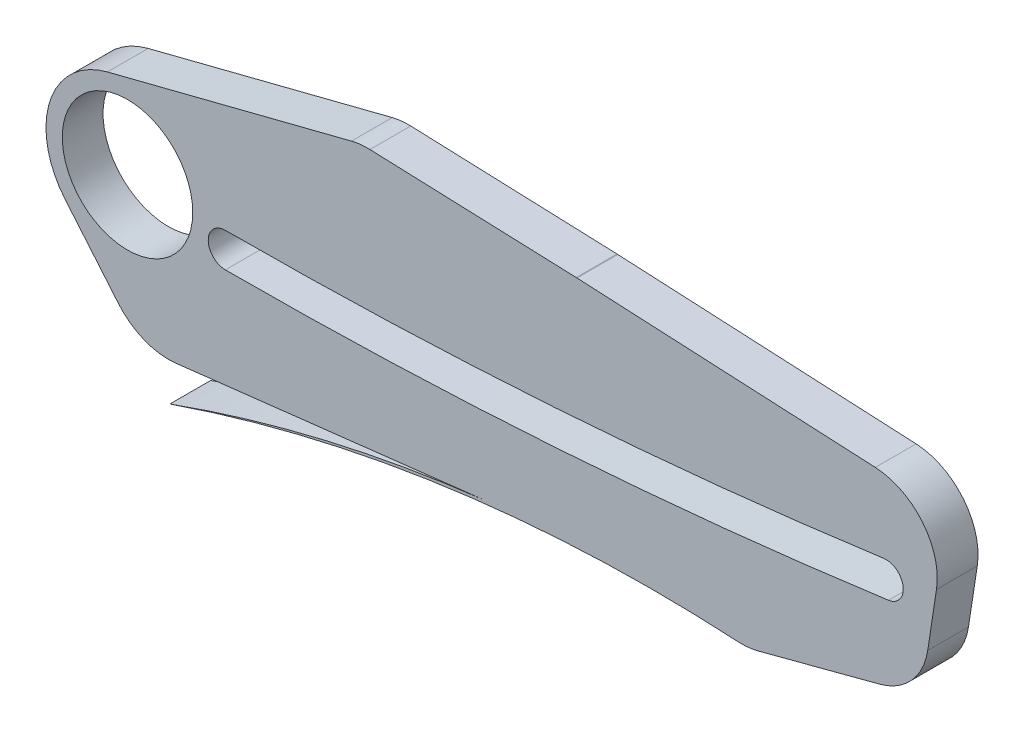
ISO-10303-21;
HEADER;
FILE_DESCRIPTION(('STEP AP214'),'2;1');
FILE_NAME('part.step','',(''),(''),'','','');
FILE_SCHEMA(('AUTOMOTIVE_DESIGN { 1 0 10303 214 1 1 1 1 }'));
ENDSEC;
DATA;
#1=APPLICATION_CONTEXT('core data for automotive mechanical design processes');
#2=APPLICATION_PROTOCOL_DEFINITION('international standard','automotive_design',2000,#1);
#3=PRODUCT_CONTEXT('',#1,'mechanical');
#4=PRODUCT('Part','Part','',(#3));
#5=PRODUCT_RELATED_PRODUCT_CATEGORY('part','',(#4));
#6=PRODUCT_DEFINITION_FORMATION('','',#4);
#7=PRODUCT_DEFINITION_CONTEXT('part definition',#1,'design');
#8=PRODUCT_DEFINITION('design','',#6,#7);
#9=PRODUCT_DEFINITION_SHAPE('','',#8);
#10=(LENGTH_UNIT() NAMED_UNIT(*) SI_UNIT(.MILLI.,.METRE.));
#11=(NAMED_UNIT(*) PLANE_ANGLE_UNIT() SI_UNIT($,.RADIAN.));
#12=(NAMED_UNIT(*) SI_UNIT($,.STERADIAN.) SOLID_ANGLE_UNIT());
#13=UNCERTAINTY_MEASURE_WITH_UNIT(LENGTH_MEASURE(1.E-05),#10,'distance_accuracy_value','');
#14=(GEOMETRIC_REPRESENTATION_CONTEXT(3) GLOBAL_UNCERTAINTY_ASSIGNED_CONTEXT((#13)) GLOBAL_UNIT_ASSIGNED_CONTEXT((#10,
#11,#12)) REPRESENTATION_CONTEXT('',''));
#15=CARTESIAN_POINT('',(0.,0.,0.));
#16=DIRECTION('',(0.,0.,1.));
#17=DIRECTION('',(1.,0.,0.));
#18=AXIS2_PLACEMENT_3D('',#15,#16,#17);
#19=CARTESIAN_POINT('',(0.,0.,1.25));
#20=DIRECTION('',(0.,0.,1.));
#21=DIRECTION('',(1.,0.,0.));
#22=AXIS2_PLACEMENT_3D('',#19,#20,#21);
#23=PLANE('',#22);
#24=CARTESIAN_POINT('',(5.99999999999999,-1.,1.25));
#25=DIRECTION('',(0.,0.,1.));
#26=DIRECTION('',(1.,0.,0.));
#27=AXIS2_PLACEMENT_3D('',#24,#25,#26);
#28=CIRCLE('',#27,1.05);
#29=CARTESIAN_POINT('',(5.99999999999995,0.0499999999999945,1.25));
#30=VERTEX_POINT('',#29);
#31=CARTESIAN_POINT('',(5.99999999999995,-2.05,1.25));
#32=VERTEX_POINT('',#31);
#33=EDGE_CURVE('E222',#30,#32,#28,.T.);
#34=ORIENTED_EDGE('',*,*,#33,.F.);
#35=CARTESIAN_POINT('',(6.,296.061931180591,1.25));
#36=DIRECTION('',(0.,0.,-1.));
#37=DIRECTION('',(1.,0.,0.));
#38=AXIS2_PLACEMENT_3D('',#35,#36,#37);
#39=CIRCLE('',#38,296.011931180591);
#40=CARTESIAN_POINT('',(46.3804692544966,2.81718509969425,1.25));
#41=VERTEX_POINT('',#40);
#42=EDGE_CURVE('E231',#41,#30,#39,.T.);
#43=ORIENTED_EDGE('',*,*,#42,.F.);
#44=CARTESIAN_POINT('',(46.5237050103937,1.77700073227061,1.25));
#45=DIRECTION('',(0.,0.,1.));
#46=DIRECTION('',(1.,0.,0.));
#47=AXIS2_PLACEMENT_3D('',#44,#45,#46);
#48=CIRCLE('',#47,1.04999999999997);
#49=CARTESIAN_POINT('',(46.6669407662909,0.736816364846959,1.25));
#50=VERTEX_POINT('',#49);
#51=EDGE_CURVE('E228',#50,#41,#48,.T.);
#52=ORIENTED_EDGE('',*,*,#51,.F.);
#53=CARTESIAN_POINT('',(6.,296.061931180591,1.25));
#54=DIRECTION('',(0.,0.,1.));
#55=DIRECTION('',(1.,0.,0.));
#56=AXIS2_PLACEMENT_3D('',#53,#54,#55);
#57=CIRCLE('',#56,298.111931180591);
#58=EDGE_CURVE('E225',#32,#50,#57,.T.);
#59=ORIENTED_EDGE('',*,*,#58,.F.);
#60=EDGE_LOOP('',(#34,#43,#52,#59));
#61=FACE_BOUND('',#60,.T.);
#62=CARTESIAN_POINT('',(0.,0.,1.25));
#63=DIRECTION('',(0.,0.,1.));
#64=DIRECTION('',(1.,0.,0.));
#65=AXIS2_PLACEMENT_3D('',#62,#63,#64);
#66=CIRCLE('',#65,4.);
#67=CARTESIAN_POINT('',(4.,0.,1.25));
#68=VERTEX_POINT('',#67);
#69=EDGE_CURVE('E244',#68,#68,#66,.T.);
#70=ORIENTED_EDGE('',*,*,#69,.F.);
#71=EDGE_LOOP('',(#70));
#72=FACE_BOUND('',#71,.T.);
#73=DIRECTION('',(-0.999300114895373,0.0374069561725541,0.));
#74=VECTOR('',#73,1.);
#75=CARTESIAN_POINT('',(14.2922695517764,8.79851771367301,1.25));
#76=LINE('',#75,#74);
#77=CARTESIAN_POINT('',(27.5170590253453,8.30347211840573,1.25));
#78=VERTEX_POINT('',#77);
#79=CARTESIAN_POINT('',(14.8692888806396,8.7769180596514,1.25));
#80=VERTEX_POINT('',#79);
#81=EDGE_CURVE('E259',#78,#80,#76,.T.);
#82=ORIENTED_EDGE('',*,*,#81,.T.);
#83=CARTESIAN_POINT('',(14.7196610559494,4.77971760006991,1.25));
#84=DIRECTION('',(0.,0.,1.));
#85=DIRECTION('',(1.,0.,0.));
#86=AXIS2_PLACEMENT_3D('',#83,#84,#85);
#87=CIRCLE('',#86,4.);
#88=CARTESIAN_POINT('',(13.7326991069287,8.6560439680613,1.25));
#89=VERTEX_POINT('',#88);
#90=EDGE_CURVE('E320',#80,#89,#87,.T.);
#91=ORIENTED_EDGE('',*,*,#90,.T.);
#92=DIRECTION('',(-0.969081591997847,-0.246740487255168,0.));
#93=VECTOR('',#92,1.);
#94=CARTESIAN_POINT('',(-1.23370243627584,4.84540795998924,1.25));
#95=LINE('',#94,#93);
#96=CARTESIAN_POINT('',(-1.23370243627584,4.84540795998924,1.25));
#97=VERTEX_POINT('',#96);
#98=EDGE_CURVE('E262',#89,#97,#95,.T.);
#99=ORIENTED_EDGE('',*,*,#98,.T.);
#100=CARTESIAN_POINT('',(0.,0.,1.25));
#101=DIRECTION('',(0.,0.,1.));
#102=DIRECTION('',(1.,0.,0.));
#103=AXIS2_PLACEMENT_3D('',#100,#101,#102);
#104=CIRCLE('',#103,5.);
#105=CARTESIAN_POINT('',(-3.83022221559487,-3.21393804843272,1.25));
#106=VERTEX_POINT('',#105);
#107=EDGE_CURVE('E250',#97,#106,#104,.T.);
#108=ORIENTED_EDGE('',*,*,#107,.T.);
#109=DIRECTION('',(-0.642787609686543,0.766044443118975,0.));
#110=VECTOR('',#109,1.);
#111=CARTESIAN_POINT('',(-3.83022221559487,-3.21393804843272,1.25));
#112=LINE('',#111,#110);
#113=CARTESIAN_POINT('',(-0.55173269820749,-7.12108970906154,1.25));
#114=VERTEX_POINT('',#113);
#115=EDGE_CURVE('E213',#114,#106,#112,.T.);
#116=ORIENTED_EDGE('',*,*,#115,.F.);
#117=CARTESIAN_POINT('',(2.51244507426841,-4.54993927031537,1.25));
#118=DIRECTION('',(0.,0.,1.));
#119=DIRECTION('',(1.,0.,0.));
#120=AXIS2_PLACEMENT_3D('',#117,#118,#119);
#121=CIRCLE('',#120,4.);
#122=CARTESIAN_POINT('',(2.97213460204943,-8.52343716738899,1.25));
#123=VERTEX_POINT('',#122);
#124=EDGE_CURVE('E310',#114,#123,#121,.T.);
#125=ORIENTED_EDGE('',*,*,#124,.T.);
#126=DIRECTION('',(0.993374474268405,0.114922381945254,0.));
#127=VECTOR('',#126,1.);
#128=CARTESIAN_POINT('',(1.01229721490937,-8.7501685628392,1.25));
#129=LINE('',#128,#127);
#130=CARTESIAN_POINT('',(21.9165652253938,-6.33177717588904,1.25));
#131=VERTEX_POINT('',#130);
#132=EDGE_CURVE('E203',#123,#131,#129,.T.);
#133=ORIENTED_EDGE('',*,*,#132,.T.);
#134=CARTESIAN_POINT('',(31.7892204060443,-91.669754719576,1.25));
#135=DIRECTION('',(0.,0.,1.));
#136=DIRECTION('',(1.,0.,0.));
#137=AXIS2_PLACEMENT_3D('',#134,#135,#136);
#138=CIRCLE('',#137,85.9071576270736);
#139=CARTESIAN_POINT('',(2.59765388127056,-10.8743824796225,1.25));
#140=VERTEX_POINT('',#139);
#141=EDGE_CURVE('E185',#131,#140,#138,.T.);
#142=ORIENTED_EDGE('',*,*,#141,.T.);
#143=CARTESIAN_POINT('',(32.20396525934,-96.971243340631,1.25));
#144=DIRECTION('',(0.,0.,1.));
#145=DIRECTION('',(-1.,0.,0.));
#146=AXIS2_PLACEMENT_3D('',#143,#144,#145);
#147=CIRCLE('',#146,91.045060950801);
#148=CARTESIAN_POINT('',(37.433307283806,-6.07648493550501,1.25));
#149=VERTEX_POINT('',#148);
#150=EDGE_CURVE('E211',#149,#140,#147,.T.);
#151=ORIENTED_EDGE('',*,*,#150,.F.);
#152=CARTESIAN_POINT('',(37.6630547064495,-2.08308837095137,1.25));
#153=DIRECTION('',(0.,0.,1.));
#154=DIRECTION('',(1.,0.,0.));
#155=AXIS2_PLACEMENT_3D('',#152,#153,#154);
#156=CIRCLE('',#155,4.);
#157=CARTESIAN_POINT('',(38.6823366414534,-5.9510418785539,1.25));
#158=VERTEX_POINT('',#157);
#159=EDGE_CURVE('E314',#149,#158,#156,.T.);
#160=ORIENTED_EDGE('',*,*,#159,.T.);
#161=DIRECTION('',(0.966988376900631,0.254820483750981,0.));
#162=VECTOR('',#161,1.);
#163=CARTESIAN_POINT('',(48.6752839390295,-3.31770343799469,1.25));
#164=LINE('',#163,#162);
#165=CARTESIAN_POINT('',(46.1390312538075,-3.986055976248,1.25));
#166=VERTEX_POINT('',#165);
#167=EDGE_CURVE('E206',#158,#166,#164,.T.);
#168=ORIENTED_EDGE('',*,*,#167,.T.);
#169=CARTESIAN_POINT('',(45.1197493188036,-0.118102468645477,1.25));
#170=DIRECTION('',(0.,0.,1.));
#171=DIRECTION('',(1.,0.,0.));
#172=AXIS2_PLACEMENT_3D('',#169,#170,#171);
#173=CIRCLE('',#172,4.);
#174=CARTESIAN_POINT('',(49.0734011325404,-0.725257585345815,1.25));
#175=VERTEX_POINT('',#174);
#176=EDGE_CURVE('E312',#166,#175,#173,.T.);
#177=ORIENTED_EDGE('',*,*,#176,.T.);
#178=DIRECTION('',(0.151788779175085,0.98841295343421,0.));
#179=VECTOR('',#178,1.);
#180=CARTESIAN_POINT('',(50.2856916724055,7.16889427120359,1.25));
#181=LINE('',#180,#179);
#182=CARTESIAN_POINT('',(49.612830244981,2.78737836240607,1.25));
#183=VERTEX_POINT('',#182);
#184=EDGE_CURVE('E253',#175,#183,#181,.T.);
#185=ORIENTED_EDGE('',*,*,#184,.T.);
#186=CARTESIAN_POINT('',(45.6591784312442,3.39453347910641,1.25));
#187=DIRECTION('',(0.,0.,1.));
#188=DIRECTION('',(1.,0.,0.));
#189=AXIS2_PLACEMENT_3D('',#186,#187,#188);
#190=CIRCLE('',#189,4.);
#191=CARTESIAN_POINT('',(45.8583081680027,7.38957382282491,1.25));
#192=VERTEX_POINT('',#191);
#193=EDGE_CURVE('E316',#183,#192,#190,.T.);
#194=ORIENTED_EDGE('',*,*,#193,.T.);
#195=DIRECTION('',(-0.998760085929626,0.0497824341896386,0.));
#196=VECTOR('',#195,1.);
#197=CARTESIAN_POINT('',(27.5418166709843,8.3025453616171,1.25));
#198=LINE('',#197,#196);
#199=CARTESIAN_POINT('',(27.5665609374137,8.30131200254274,1.25));
#200=VERTEX_POINT('',#199);
#201=EDGE_CURVE('E257',#192,#200,#198,.T.);
#202=ORIENTED_EDGE('',*,*,#201,.T.);
#203=CARTESIAN_POINT('',(27.3674312006551,4.30627165882424,1.25));
#204=DIRECTION('',(0.,0.,1.));
#205=DIRECTION('',(1.,0.,0.));
#206=AXIS2_PLACEMENT_3D('',#203,#204,#205);
#207=CIRCLE('',#206,4.);
#208=EDGE_CURVE('E318',#200,#78,#207,.T.);
#209=ORIENTED_EDGE('',*,*,#208,.T.);
#210=EDGE_LOOP('',(#82,#91,#99,#108,#116,#125,#133,#142,#151,#160,#168,#177,#185,#194,#202,#209));
#211=FACE_BOUND('',#210,.T.);
#212=ADVANCED_FACE('F38',(#61,#72,#211),#23,.T.);
#213=CARTESIAN_POINT('',(0.,0.,-1.25));
#214=DIRECTION('',(0.,0.,1.));
#215=DIRECTION('',(1.,0.,0.));
#216=AXIS2_PLACEMENT_3D('',#213,#214,#215);
#217=PLANE('',#216);
#218=CARTESIAN_POINT('',(0.,0.,-1.25));
#219=DIRECTION('',(0.,0.,1.));
#220=DIRECTION('',(1.,0.,0.));
#221=AXIS2_PLACEMENT_3D('',#218,#219,#220);
#222=CIRCLE('',#221,4.);
#223=CARTESIAN_POINT('',(4.,0.,-1.25));
#224=VERTEX_POINT('',#223);
#225=EDGE_CURVE('E237',#224,#224,#222,.T.);
#226=ORIENTED_EDGE('',*,*,#225,.T.);
#227=EDGE_LOOP('',(#226));
#228=FACE_BOUND('',#227,.T.);
#229=CARTESIAN_POINT('',(6.,296.061931180591,-1.25));
#230=DIRECTION('',(0.,0.,1.));
#231=DIRECTION('',(1.,0.,0.));
#232=AXIS2_PLACEMENT_3D('',#229,#230,#231);
#233=CIRCLE('',#232,296.011931180591);
#234=CARTESIAN_POINT('',(46.3804692544966,2.81718509969425,-1.25));
#235=VERTEX_POINT('',#234);
#236=CARTESIAN_POINT('',(5.99999999999995,0.0499999999999945,-1.25));
#237=VERTEX_POINT('',#236);
#238=EDGE_CURVE('E284',#235,#237,#233,.F.);
#239=ORIENTED_EDGE('',*,*,#238,.T.);
#240=CARTESIAN_POINT('',(5.99999999999999,-1.,-1.25));
#241=DIRECTION('',(0.,0.,1.));
#242=DIRECTION('',(1.,0.,0.));
#243=AXIS2_PLACEMENT_3D('',#240,#241,#242);
#244=CIRCLE('',#243,1.05);
#245=CARTESIAN_POINT('',(5.99999999999995,-2.05,-1.25));
#246=VERTEX_POINT('',#245);
#247=EDGE_CURVE('E287',#237,#246,#244,.T.);
#248=ORIENTED_EDGE('',*,*,#247,.T.);
#249=CARTESIAN_POINT('',(6.,296.061931180591,-1.25));
#250=DIRECTION('',(0.,0.,1.));
#251=DIRECTION('',(1.,0.,0.));
#252=AXIS2_PLACEMENT_3D('',#249,#250,#251);
#253=CIRCLE('',#252,298.111931180591);
#254=CARTESIAN_POINT('',(46.6669407662909,0.736816364846959,-1.25));
#255=VERTEX_POINT('',#254);
#256=EDGE_CURVE('E278',#246,#255,#253,.T.);
#257=ORIENTED_EDGE('',*,*,#256,.T.);
#258=CARTESIAN_POINT('',(46.5237050103937,1.77700073227061,-1.25));
#259=DIRECTION('',(0.,0.,1.));
#260=DIRECTION('',(1.,0.,0.));
#261=AXIS2_PLACEMENT_3D('',#258,#259,#260);
#262=CIRCLE('',#261,1.04999999999997);
#263=EDGE_CURVE('E281',#255,#235,#262,.T.);
#264=ORIENTED_EDGE('',*,*,#263,.T.);
#265=EDGE_LOOP('',(#239,#248,#257,#264));
#266=FACE_BOUND('',#265,.T.);
#267=DIRECTION('',(-0.969081591997847,-0.246740487255168,0.));
#268=VECTOR('',#267,1.);
#269=CARTESIAN_POINT('',(-1.23370243627584,4.84540795998924,-1.25));
#270=LINE('',#269,#268);
#271=CARTESIAN_POINT('',(13.7326991069287,8.6560439680613,-1.25));
#272=VERTEX_POINT('',#271);
#273=CARTESIAN_POINT('',(-1.23370243627584,4.84540795998924,-1.25));
#274=VERTEX_POINT('',#273);
#275=EDGE_CURVE('E254',#272,#274,#270,.T.);
#276=ORIENTED_EDGE('',*,*,#275,.F.);
#277=CARTESIAN_POINT('',(14.7196610559494,4.77971760006991,-1.25));
#278=DIRECTION('',(0.,0.,1.));
#279=DIRECTION('',(1.,0.,0.));
#280=AXIS2_PLACEMENT_3D('',#277,#278,#279);
#281=CIRCLE('',#280,4.);
#282=CARTESIAN_POINT('',(14.8692888806396,8.7769180596514,-1.25));
#283=VERTEX_POINT('',#282);
#284=EDGE_CURVE('E303',#272,#283,#281,.F.);
#285=ORIENTED_EDGE('',*,*,#284,.T.);
#286=DIRECTION('',(-0.999300114895373,0.0374069561725541,0.));
#287=VECTOR('',#286,1.);
#288=CARTESIAN_POINT('',(14.2922695517764,8.79851771367301,-1.25));
#289=LINE('',#288,#287);
#290=CARTESIAN_POINT('',(27.5170590253453,8.30347211840573,-1.25));
#291=VERTEX_POINT('',#290);
#292=EDGE_CURVE('E272',#291,#283,#289,.T.);
#293=ORIENTED_EDGE('',*,*,#292,.F.);
#294=CARTESIAN_POINT('',(27.3674312006551,4.30627165882424,-1.25));
#295=DIRECTION('',(0.,0.,1.));
#296=DIRECTION('',(1.,0.,0.));
#297=AXIS2_PLACEMENT_3D('',#294,#295,#296);
#298=CIRCLE('',#297,4.);
#299=CARTESIAN_POINT('',(27.5665609374137,8.30131200254274,-1.25));
#300=VERTEX_POINT('',#299);
#301=EDGE_CURVE('E301',#291,#300,#298,.F.);
#302=ORIENTED_EDGE('',*,*,#301,.T.);
#303=DIRECTION('',(-0.998760085929626,0.0497824341896386,0.));
#304=VECTOR('',#303,1.);
#305=CARTESIAN_POINT('',(27.5418166709843,8.3025453616171,-1.25));
#306=LINE('',#305,#304);
#307=CARTESIAN_POINT('',(45.8583081680027,7.38957382282491,-1.25));
#308=VERTEX_POINT('',#307);
#309=EDGE_CURVE('E270',#308,#300,#306,.T.);
#310=ORIENTED_EDGE('',*,*,#309,.F.);
#311=CARTESIAN_POINT('',(45.6591784312442,3.39453347910641,-1.25));
#312=DIRECTION('',(0.,0.,1.));
#313=DIRECTION('',(1.,0.,0.));
#314=AXIS2_PLACEMENT_3D('',#311,#312,#313);
#315=CIRCLE('',#314,4.);
#316=CARTESIAN_POINT('',(49.612830244981,2.78737836240607,-1.25));
#317=VERTEX_POINT('',#316);
#318=EDGE_CURVE('E299',#308,#317,#315,.F.);
#319=ORIENTED_EDGE('',*,*,#318,.T.);
#320=DIRECTION('',(0.151788779175085,0.98841295343421,0.));
#321=VECTOR('',#320,1.);
#322=CARTESIAN_POINT('',(50.2856916724055,7.16889427120359,-1.25));
#323=LINE('',#322,#321);
#324=CARTESIAN_POINT('',(49.0734011325404,-0.725257585345815,-1.25));
#325=VERTEX_POINT('',#324);
#326=EDGE_CURVE('E267',#325,#317,#323,.T.);
#327=ORIENTED_EDGE('',*,*,#326,.F.);
#328=CARTESIAN_POINT('',(45.1197493188036,-0.118102468645477,-1.25));
#329=DIRECTION('',(0.,0.,1.));
#330=DIRECTION('',(1.,0.,0.));
#331=AXIS2_PLACEMENT_3D('',#328,#329,#330);
#332=CIRCLE('',#331,4.);
#333=CARTESIAN_POINT('',(46.1390312538075,-3.986055976248,-1.25));
#334=VERTEX_POINT('',#333);
#335=EDGE_CURVE('E295',#325,#334,#332,.F.);
#336=ORIENTED_EDGE('',*,*,#335,.T.);
#337=DIRECTION('',(0.966988376900631,0.254820483750981,0.));
#338=VECTOR('',#337,1.);
#339=CARTESIAN_POINT('',(48.6752839390295,-3.31770343799469,-1.25));
#340=LINE('',#339,#338);
#341=CARTESIAN_POINT('',(38.6823366414534,-5.9510418785539,-1.25));
#342=VERTEX_POINT('',#341);
#343=EDGE_CURVE('E205',#342,#334,#340,.T.);
#344=ORIENTED_EDGE('',*,*,#343,.F.);
#345=CARTESIAN_POINT('',(37.6630547064495,-2.08308837095137,-1.25));
#346=DIRECTION('',(0.,0.,1.));
#347=DIRECTION('',(1.,0.,0.));
#348=AXIS2_PLACEMENT_3D('',#345,#346,#347);
#349=CIRCLE('',#348,4.);
#350=CARTESIAN_POINT('',(37.433307283806,-6.07648493550501,-1.25));
#351=VERTEX_POINT('',#350);
#352=EDGE_CURVE('E297',#342,#351,#349,.F.);
#353=ORIENTED_EDGE('',*,*,#352,.T.);
#354=CARTESIAN_POINT('',(32.20396525934,-96.971243340631,-1.25));
#355=DIRECTION('',(0.,0.,1.));
#356=DIRECTION('',(-1.,0.,0.));
#357=AXIS2_PLACEMENT_3D('',#354,#355,#356);
#358=CIRCLE('',#357,91.045060950801);
#359=CARTESIAN_POINT('',(2.59765388127057,-10.8743824796225,-1.25));
#360=VERTEX_POINT('',#359);
#361=EDGE_CURVE('E199',#351,#360,#358,.T.);
#362=ORIENTED_EDGE('',*,*,#361,.T.);
#363=CARTESIAN_POINT('',(31.7892204060443,-91.669754719576,-1.25));
#364=DIRECTION('',(0.,0.,-1.));
#365=DIRECTION('',(-1.,0.,0.));
#366=AXIS2_PLACEMENT_3D('',#363,#364,#365);
#367=CIRCLE('',#366,85.9071576270736);
#368=CARTESIAN_POINT('',(21.9165652253938,-6.33177717588904,-1.25));
#369=VERTEX_POINT('',#368);
#370=EDGE_CURVE('E182',#360,#369,#367,.T.);
#371=ORIENTED_EDGE('',*,*,#370,.T.);
#372=DIRECTION('',(-0.993374474268405,-0.114922381945254,0.));
#373=VECTOR('',#372,1.);
#374=CARTESIAN_POINT('',(1.01229721490937,-8.7501685628392,-1.25));
#375=LINE('',#374,#373);
#376=CARTESIAN_POINT('',(2.97213460204943,-8.52343716738899,-1.25));
#377=VERTEX_POINT('',#376);
#378=EDGE_CURVE('E188',#369,#377,#375,.T.);
#379=ORIENTED_EDGE('',*,*,#378,.T.);
#380=CARTESIAN_POINT('',(2.51244507426841,-4.54993927031537,-1.25));
#381=DIRECTION('',(0.,0.,1.));
#382=DIRECTION('',(1.,0.,0.));
#383=AXIS2_PLACEMENT_3D('',#380,#381,#382);
#384=CIRCLE('',#383,4.);
#385=CARTESIAN_POINT('',(-0.55173269820749,-7.12108970906154,-1.25));
#386=VERTEX_POINT('',#385);
#387=EDGE_CURVE('E293',#377,#386,#384,.F.);
#388=ORIENTED_EDGE('',*,*,#387,.T.);
#389=DIRECTION('',(-0.642787609686543,0.766044443118975,0.));
#390=VECTOR('',#389,1.);
#391=CARTESIAN_POINT('',(-3.83022221559487,-3.21393804843272,-1.25));
#392=LINE('',#391,#390);
#393=CARTESIAN_POINT('',(-3.83022221559487,-3.21393804843272,-1.25));
#394=VERTEX_POINT('',#393);
#395=EDGE_CURVE('E214',#386,#394,#392,.T.);
#396=ORIENTED_EDGE('',*,*,#395,.T.);
#397=CARTESIAN_POINT('',(0.,0.,-1.25));
#398=DIRECTION('',(0.,0.,1.));
#399=DIRECTION('',(1.,0.,0.));
#400=AXIS2_PLACEMENT_3D('',#397,#398,#399);
#401=CIRCLE('',#400,5.);
#402=EDGE_CURVE('E247',#274,#394,#401,.T.);
#403=ORIENTED_EDGE('',*,*,#402,.F.);
#404=EDGE_LOOP('',(#276,#285,#293,#302,#310,#319,#327,#336,#344,#353,#362,#371,#379,#388,#396,#403));
#405=FACE_BOUND('',#404,.T.);
#406=ADVANCED_FACE('F197',(#228,#266,#405),#217,.F.);
#407=CARTESIAN_POINT('',(-3.83022221559487,-3.21393804843272,1.25));
#408=DIRECTION('',(-0.766044443118975,-0.642787609686543,0.));
#409=DIRECTION('',(0.642787609686543,-0.766044443118975,0.));
#410=AXIS2_PLACEMENT_3D('',#407,#408,#409);
#411=PLANE('',#410);
#412=ORIENTED_EDGE('',*,*,#395,.F.);
#413=DIRECTION('',(0.,0.,-1.));
#414=VECTOR('',#413,1.);
#415=CARTESIAN_POINT('',(-0.551732698207489,-7.12108970906154,1.25));
#416=LINE('',#415,#414);
#417=EDGE_CURVE('E11',#386,#114,#416,.F.);
#418=ORIENTED_EDGE('',*,*,#417,.T.);
#419=ORIENTED_EDGE('',*,*,#115,.T.);
#420=DIRECTION('',(0.,0.,-1.));
#421=VECTOR('',#420,1.);
#422=CARTESIAN_POINT('',(-3.83022221559487,-3.21393804843272,1.25));
#423=LINE('',#422,#421);
#424=EDGE_CURVE('E219',#106,#394,#423,.T.);
#425=ORIENTED_EDGE('',*,*,#424,.T.);
#426=EDGE_LOOP('',(#412,#418,#419,#425));
#427=FACE_BOUND('',#426,.T.);
#428=ADVANCED_FACE('F390',(#427),#411,.T.);
#429=CARTESIAN_POINT('',(0.,0.,1.25));
#430=DIRECTION('',(0.,0.,-1.));
#431=DIRECTION('',(-1.,0.,0.));
#432=AXIS2_PLACEMENT_3D('',#429,#430,#431);
#433=CYLINDRICAL_SURFACE('',#432,5.);
#434=ORIENTED_EDGE('',*,*,#424,.F.);
#435=ORIENTED_EDGE('',*,*,#107,.F.);
#436=DIRECTION('',(0.,0.,-1.));
#437=VECTOR('',#436,1.);
#438=CARTESIAN_POINT('',(-1.23370243627584,4.84540795998924,1.25));
#439=LINE('',#438,#437);
#440=EDGE_CURVE('E264',#97,#274,#439,.T.);
#441=ORIENTED_EDGE('',*,*,#440,.T.);
#442=ORIENTED_EDGE('',*,*,#402,.T.);
#443=EDGE_LOOP('',(#434,#435,#441,#442));
#444=FACE_BOUND('',#443,.T.);
#445=ADVANCED_FACE('F386',(#444),#433,.T.);
#446=CARTESIAN_POINT('',(50.2856916724055,7.16889427120359,1.25));
#447=DIRECTION('',(-0.98841295343421,0.151788779175085,0.));
#448=DIRECTION('',(-0.151788779175085,-0.98841295343421,0.));
#449=AXIS2_PLACEMENT_3D('',#446,#447,#448);
#450=PLANE('',#449);
#451=ORIENTED_EDGE('',*,*,#326,.T.);
#452=DIRECTION('',(0.,0.,-1.));
#453=VECTOR('',#452,1.);
#454=CARTESIAN_POINT('',(49.612830244981,2.78737836240607,1.25));
#455=LINE('',#454,#453);
#456=EDGE_CURVE('E329',#317,#183,#455,.F.);
#457=ORIENTED_EDGE('',*,*,#456,.T.);
#458=ORIENTED_EDGE('',*,*,#184,.F.);
#459=DIRECTION('',(0.,0.,-1.));
#460=VECTOR('',#459,1.);
#461=CARTESIAN_POINT('',(49.0734011325404,-0.725257585345817,1.25));
#462=LINE('',#461,#460);
#463=EDGE_CURVE('E326',#175,#325,#462,.T.);
#464=ORIENTED_EDGE('',*,*,#463,.T.);
#465=EDGE_LOOP('',(#451,#457,#458,#464));
#466=FACE_BOUND('',#465,.T.);
#467=ADVANCED_FACE('F358',(#466),#450,.F.);
#468=CARTESIAN_POINT('',(27.5418166709843,8.3025453616171,1.25));
#469=DIRECTION('',(-0.0497824341896386,-0.998760085929626,0.));
#470=DIRECTION('',(0.998760085929626,-0.0497824341896386,0.));
#471=AXIS2_PLACEMENT_3D('',#468,#469,#470);
#472=PLANE('',#471);
#473=ORIENTED_EDGE('',*,*,#309,.T.);
#474=DIRECTION('',(0.,0.,-1.));
#475=VECTOR('',#474,1.);
#476=CARTESIAN_POINT('',(27.5665609374137,8.30131200254274,1.25));
#477=LINE('',#476,#475);
#478=EDGE_CURVE('E59',#300,#200,#477,.F.);
#479=ORIENTED_EDGE('',*,*,#478,.T.);
#480=ORIENTED_EDGE('',*,*,#201,.F.);
#481=DIRECTION('',(0.,0.,-1.));
#482=VECTOR('',#481,1.);
#483=CARTESIAN_POINT('',(45.8583081680027,7.38957382282491,1.25));
#484=LINE('',#483,#482);
#485=EDGE_CURVE('E322',#192,#308,#484,.T.);
#486=ORIENTED_EDGE('',*,*,#485,.T.);
#487=EDGE_LOOP('',(#473,#479,#480,#486));
#488=FACE_BOUND('',#487,.T.);
#489=ADVANCED_FACE('F365',(#488),#472,.F.);
#490=CARTESIAN_POINT('',(14.2922695517764,8.79851771367301,1.25));
#491=DIRECTION('',(-0.0374069561725541,-0.999300114895373,0.));
#492=DIRECTION('',(0.999300114895373,-0.0374069561725541,0.));
#493=AXIS2_PLACEMENT_3D('',#490,#491,#492);
#494=PLANE('',#493);
#495=ORIENTED_EDGE('',*,*,#292,.T.);
#496=DIRECTION('',(0.,0.,-1.));
#497=VECTOR('',#496,1.);
#498=CARTESIAN_POINT('',(14.8692888806396,8.7769180596514,1.25));
#499=LINE('',#498,#497);
#500=EDGE_CURVE('E308',#283,#80,#499,.F.);
#501=ORIENTED_EDGE('',*,*,#500,.T.);
#502=ORIENTED_EDGE('',*,*,#81,.F.);
#503=DIRECTION('',(0.,0.,-1.));
#504=VECTOR('',#503,1.);
#505=CARTESIAN_POINT('',(27.5170590253453,8.30347211840573,1.25));
#506=LINE('',#505,#504);
#507=EDGE_CURVE('E305',#78,#291,#506,.T.);
#508=ORIENTED_EDGE('',*,*,#507,.T.);
#509=EDGE_LOOP('',(#495,#501,#502,#508));
#510=FACE_BOUND('',#509,.T.);
#511=ADVANCED_FACE('F373',(#510),#494,.F.);
#512=CARTESIAN_POINT('',(-1.23370243627584,4.84540795998924,1.25));
#513=DIRECTION('',(0.246740487255168,-0.969081591997847,0.));
#514=DIRECTION('',(0.969081591997847,0.246740487255168,0.));
#515=AXIS2_PLACEMENT_3D('',#512,#513,#514);
#516=PLANE('',#515);
#517=ORIENTED_EDGE('',*,*,#98,.F.);
#518=DIRECTION('',(0.,0.,-1.));
#519=VECTOR('',#518,1.);
#520=CARTESIAN_POINT('',(13.7326991069287,8.6560439680613,1.25));
#521=LINE('',#520,#519);
#522=EDGE_CURVE('E290',#89,#272,#521,.T.);
#523=ORIENTED_EDGE('',*,*,#522,.T.);
#524=ORIENTED_EDGE('',*,*,#275,.T.);
#525=ORIENTED_EDGE('',*,*,#440,.F.);
#526=EDGE_LOOP('',(#517,#523,#524,#525));
#527=FACE_BOUND('',#526,.T.);
#528=ADVANCED_FACE('F381',(#527),#516,.F.);
#529=CARTESIAN_POINT('',(0.,0.,1.25));
#530=DIRECTION('',(0.,0.,-1.));
#531=DIRECTION('',(-1.,0.,0.));
#532=AXIS2_PLACEMENT_3D('',#529,#530,#531);
#533=CYLINDRICAL_SURFACE('',#532,4.);
#534=ORIENTED_EDGE('',*,*,#69,.T.);
#535=EDGE_LOOP('',(#534));
#536=FACE_BOUND('',#535,.T.);
#537=ORIENTED_EDGE('',*,*,#225,.F.);
#538=EDGE_LOOP('',(#537));
#539=FACE_BOUND('',#538,.T.);
#540=ADVANCED_FACE('F410',(#536,#539),#533,.F.);
#541=CARTESIAN_POINT('',(5.99999999999999,-1.,-20.75));
#542=DIRECTION('',(0.,0.,1.));
#543=DIRECTION('',(1.,0.,0.));
#544=AXIS2_PLACEMENT_3D('',#541,#542,#543);
#545=CYLINDRICAL_SURFACE('',#544,1.05);
#546=DIRECTION('',(0.,0.,1.));
#547=VECTOR('',#546,1.);
#548=CARTESIAN_POINT('',(5.99999999999995,0.0499999999999945,-20.75));
#549=LINE('',#548,#547);
#550=EDGE_CURVE('E235',#237,#30,#549,.T.);
#551=ORIENTED_EDGE('',*,*,#550,.T.);
#552=ORIENTED_EDGE('',*,*,#33,.T.);
#553=DIRECTION('',(0.,0.,1.));
#554=VECTOR('',#553,1.);
#555=CARTESIAN_POINT('',(5.99999999999995,-2.05,-20.75));
#556=LINE('',#555,#554);
#557=EDGE_CURVE('E234',#246,#32,#556,.T.);
#558=ORIENTED_EDGE('',*,*,#557,.F.);
#559=ORIENTED_EDGE('',*,*,#247,.F.);
#560=EDGE_LOOP('',(#551,#552,#558,#559));
#561=FACE_BOUND('',#560,.T.);
#562=ADVANCED_FACE('F584',(#561),#545,.F.);
#563=CARTESIAN_POINT('',(6.,296.061931180591,-20.75));
#564=DIRECTION('',(0.,0.,1.));
#565=DIRECTION('',(1.,0.,0.));
#566=AXIS2_PLACEMENT_3D('',#563,#564,#565);
#567=CYLINDRICAL_SURFACE('',#566,296.011931180591);
#568=DIRECTION('',(0.,0.,1.));
#569=VECTOR('',#568,1.);
#570=CARTESIAN_POINT('',(46.3804692544966,2.81718509969425,-20.75));
#571=LINE('',#570,#569);
#572=EDGE_CURVE('E238',#235,#41,#571,.T.);
#573=ORIENTED_EDGE('',*,*,#572,.T.);
#574=ORIENTED_EDGE('',*,*,#42,.T.);
#575=ORIENTED_EDGE('',*,*,#550,.F.);
#576=ORIENTED_EDGE('',*,*,#238,.F.);
#577=EDGE_LOOP('',(#573,#574,#575,#576));
#578=FACE_BOUND('',#577,.T.);
#579=ADVANCED_FACE('F573',(#578),#567,.T.);
#580=CARTESIAN_POINT('',(46.5237050103937,1.77700073227061,-20.75));
#581=DIRECTION('',(0.,0.,1.));
#582=DIRECTION('',(1.,0.,0.));
#583=AXIS2_PLACEMENT_3D('',#580,#581,#582);
#584=CYLINDRICAL_SURFACE('',#583,1.04999999999997);
#585=DIRECTION('',(0.,0.,1.));
#586=VECTOR('',#585,1.);
#587=CARTESIAN_POINT('',(46.6669407662909,0.736816364846959,-20.75));
#588=LINE('',#587,#586);
#589=EDGE_CURVE('E240',#255,#50,#588,.T.);
#590=ORIENTED_EDGE('',*,*,#589,.T.);
#591=ORIENTED_EDGE('',*,*,#51,.T.);
#592=ORIENTED_EDGE('',*,*,#572,.F.);
#593=ORIENTED_EDGE('',*,*,#263,.F.);
#594=EDGE_LOOP('',(#590,#591,#592,#593));
#595=FACE_BOUND('',#594,.T.);
#596=ADVANCED_FACE('F563',(#595),#584,.F.);
#597=CARTESIAN_POINT('',(6.,296.061931180591,-20.75));
#598=DIRECTION('',(0.,0.,1.));
#599=DIRECTION('',(1.,0.,0.));
#600=AXIS2_PLACEMENT_3D('',#597,#598,#599);
#601=CYLINDRICAL_SURFACE('',#600,298.111931180591);
#602=ORIENTED_EDGE('',*,*,#557,.T.);
#603=ORIENTED_EDGE('',*,*,#58,.T.);
#604=ORIENTED_EDGE('',*,*,#589,.F.);
#605=ORIENTED_EDGE('',*,*,#256,.F.);
#606=EDGE_LOOP('',(#602,#603,#604,#605));
#607=FACE_BOUND('',#606,.T.);
#608=ADVANCED_FACE('F497',(#607),#601,.F.);
#609=CARTESIAN_POINT('',(32.20396525934,-96.971243340631,1.25));
#610=DIRECTION('',(0.,0.,-1.));
#611=DIRECTION('',(-1.,0.,0.));
#612=AXIS2_PLACEMENT_3D('',#609,#610,#611);
#613=CYLINDRICAL_SURFACE('',#612,91.045060950801);
#614=ORIENTED_EDGE('',*,*,#361,.F.);
#615=DIRECTION('',(0.,0.,-1.));
#616=VECTOR('',#615,1.);
#617=CARTESIAN_POINT('',(37.433307283806,-6.07648493550501,1.25));
#618=LINE('',#617,#616);
#619=EDGE_CURVE('E336',#351,#149,#618,.F.);
#620=ORIENTED_EDGE('',*,*,#619,.T.);
#621=ORIENTED_EDGE('',*,*,#150,.T.);
#622=DIRECTION('',(0.,0.,-1.));
#623=VECTOR('',#622,1.);
#624=CARTESIAN_POINT('',(2.59765388127057,-10.8743824796225,1.25));
#625=LINE('',#624,#623);
#626=EDGE_CURVE('E216',#140,#360,#625,.T.);
#627=ORIENTED_EDGE('',*,*,#626,.T.);
#628=EDGE_LOOP('',(#614,#620,#621,#627));
#629=FACE_BOUND('',#628,.T.);
#630=ADVANCED_FACE('F340',(#629),#613,.F.);
#631=CARTESIAN_POINT('',(48.6752839390295,-3.31770343799469,1.25));
#632=DIRECTION('',(-0.254820483750981,0.966988376900631,0.));
#633=DIRECTION('',(-0.966988376900631,-0.254820483750981,0.));
#634=AXIS2_PLACEMENT_3D('',#631,#632,#633);
#635=PLANE('',#634);
#636=ORIENTED_EDGE('',*,*,#167,.F.);
#637=DIRECTION('',(0.,0.,1.));
#638=VECTOR('',#637,1.);
#639=CARTESIAN_POINT('',(38.6823366414534,-5.9510418785539,-1.25));
#640=LINE('',#639,#638);
#641=EDGE_CURVE('E333',#158,#342,#640,.F.);
#642=ORIENTED_EDGE('',*,*,#641,.T.);
#643=ORIENTED_EDGE('',*,*,#343,.T.);
#644=DIRECTION('',(0.,0.,-1.));
#645=VECTOR('',#644,1.);
#646=CARTESIAN_POINT('',(46.1390312538075,-3.986055976248,1.25));
#647=LINE('',#646,#645);
#648=EDGE_CURVE('E331',#334,#166,#647,.F.);
#649=ORIENTED_EDGE('',*,*,#648,.T.);
#650=EDGE_LOOP('',(#636,#642,#643,#649));
#651=FACE_BOUND('',#650,.T.);
#652=ADVANCED_FACE('F349',(#651),#635,.F.);
#653=CARTESIAN_POINT('',(31.7892204060443,-91.669754719576,8.75));
#654=DIRECTION('',(0.,0.,-1.));
#655=DIRECTION('',(-1.,0.,0.));
#656=AXIS2_PLACEMENT_3D('',#653,#654,#655);
#657=CYLINDRICAL_SURFACE('',#656,85.9071576270736);
#658=DIRECTION('',(0.,0.,-1.));
#659=VECTOR('',#658,1.);
#660=CARTESIAN_POINT('',(21.9165652253938,-6.33177717588904,8.75));
#661=LINE('',#660,#659);
#662=EDGE_CURVE('E177',#131,#369,#661,.T.);
#663=ORIENTED_EDGE('',*,*,#662,.T.);
#664=ORIENTED_EDGE('',*,*,#370,.F.);
#665=ORIENTED_EDGE('',*,*,#626,.F.);
#666=ORIENTED_EDGE('',*,*,#141,.F.);
#667=EDGE_LOOP('',(#663,#664,#665,#666));
#668=FACE_BOUND('',#667,.T.);
#669=ADVANCED_FACE('F179',(#668),#657,.T.);
#670=CARTESIAN_POINT('',(1.01229721490937,-8.7501685628392,8.75));
#671=DIRECTION('',(0.114922381945254,-0.993374474268405,0.));
#672=DIRECTION('',(0.993374474268405,0.114922381945254,0.));
#673=AXIS2_PLACEMENT_3D('',#670,#671,#672);
#674=PLANE('',#673);
#675=ORIENTED_EDGE('',*,*,#132,.F.);
#676=DIRECTION('',(0.,0.,-1.));
#677=VECTOR('',#676,1.);
#678=CARTESIAN_POINT('',(2.97213460204943,-8.52343716738899,8.75));
#679=LINE('',#678,#677);
#680=EDGE_CURVE('E46',#123,#377,#679,.T.);
#681=ORIENTED_EDGE('',*,*,#680,.T.);
#682=ORIENTED_EDGE('',*,*,#378,.F.);
#683=ORIENTED_EDGE('',*,*,#662,.F.);
#684=EDGE_LOOP('',(#675,#681,#682,#683));
#685=FACE_BOUND('',#684,.T.);
#686=ADVANCED_FACE('F192',(#685),#674,.T.);
#687=CARTESIAN_POINT('',(14.7196610559494,4.77971760006991,1.25));
#688=DIRECTION('',(0.,0.,-1.));
#689=DIRECTION('',(-1.,0.,0.));
#690=AXIS2_PLACEMENT_3D('',#687,#688,#689);
#691=CYLINDRICAL_SURFACE('',#690,4.);
#692=ORIENTED_EDGE('',*,*,#90,.F.);
#693=ORIENTED_EDGE('',*,*,#500,.F.);
#694=ORIENTED_EDGE('',*,*,#284,.F.);
#695=ORIENTED_EDGE('',*,*,#522,.F.);
#696=EDGE_LOOP('',(#692,#693,#694,#695));
#697=FACE_BOUND('',#696,.T.);
#698=ADVANCED_FACE('F379',(#697),#691,.T.);
#699=CARTESIAN_POINT('',(27.3674312006551,4.30627165882424,1.25));
#700=DIRECTION('',(0.,0.,-1.));
#701=DIRECTION('',(-1.,0.,0.));
#702=AXIS2_PLACEMENT_3D('',#699,#700,#701);
#703=CYLINDRICAL_SURFACE('',#702,4.);
#704=ORIENTED_EDGE('',*,*,#208,.F.);
#705=ORIENTED_EDGE('',*,*,#478,.F.);
#706=ORIENTED_EDGE('',*,*,#301,.F.);
#707=ORIENTED_EDGE('',*,*,#507,.F.);
#708=EDGE_LOOP('',(#704,#705,#706,#707));
#709=FACE_BOUND('',#708,.T.);
#710=ADVANCED_FACE('F370',(#709),#703,.T.);
#711=CARTESIAN_POINT('',(45.6591784312442,3.39453347910641,1.25));
#712=DIRECTION('',(0.,0.,-1.));
#713=DIRECTION('',(-1.,0.,0.));
#714=AXIS2_PLACEMENT_3D('',#711,#712,#713);
#715=CYLINDRICAL_SURFACE('',#714,4.);
#716=ORIENTED_EDGE('',*,*,#193,.F.);
#717=ORIENTED_EDGE('',*,*,#456,.F.);
#718=ORIENTED_EDGE('',*,*,#318,.F.);
#719=ORIENTED_EDGE('',*,*,#485,.F.);
#720=EDGE_LOOP('',(#716,#717,#718,#719));
#721=FACE_BOUND('',#720,.T.);
#722=ADVANCED_FACE('F363',(#721),#715,.T.);
#723=CARTESIAN_POINT('',(37.6630547064495,-2.08308837095137,1.25));
#724=DIRECTION('',(0.,0.,-1.));
#725=DIRECTION('',(-1.,0.,0.));
#726=AXIS2_PLACEMENT_3D('',#723,#724,#725);
#727=CYLINDRICAL_SURFACE('',#726,4.);
#728=ORIENTED_EDGE('',*,*,#159,.F.);
#729=ORIENTED_EDGE('',*,*,#619,.F.);
#730=ORIENTED_EDGE('',*,*,#352,.F.);
#731=ORIENTED_EDGE('',*,*,#641,.F.);
#732=EDGE_LOOP('',(#728,#729,#730,#731));
#733=FACE_BOUND('',#732,.T.);
#734=ADVANCED_FACE('F346',(#733),#727,.T.);
#735=CARTESIAN_POINT('',(45.1197493188036,-0.118102468645477,1.25));
#736=DIRECTION('',(0.,0.,-1.));
#737=DIRECTION('',(-1.,0.,0.));
#738=AXIS2_PLACEMENT_3D('',#735,#736,#737);
#739=CYLINDRICAL_SURFACE('',#738,4.);
#740=ORIENTED_EDGE('',*,*,#176,.F.);
#741=ORIENTED_EDGE('',*,*,#648,.F.);
#742=ORIENTED_EDGE('',*,*,#335,.F.);
#743=ORIENTED_EDGE('',*,*,#463,.F.);
#744=EDGE_LOOP('',(#740,#741,#742,#743));
#745=FACE_BOUND('',#744,.T.);
#746=ADVANCED_FACE('F355',(#745),#739,.T.);
#747=CARTESIAN_POINT('',(2.51244507426841,-4.54993927031537,8.75));
#748=DIRECTION('',(0.,0.,-1.));
#749=DIRECTION('',(-1.,0.,0.));
#750=AXIS2_PLACEMENT_3D('',#747,#748,#749);
#751=CYLINDRICAL_SURFACE('',#750,4.);
#752=ORIENTED_EDGE('',*,*,#124,.F.);
#753=ORIENTED_EDGE('',*,*,#417,.F.);
#754=ORIENTED_EDGE('',*,*,#387,.F.);
#755=ORIENTED_EDGE('',*,*,#680,.F.);
#756=EDGE_LOOP('',(#752,#753,#754,#755));
#757=FACE_BOUND('',#756,.T.);
#758=ADVANCED_FACE('F40',(#757),#751,.T.);
#759=CLOSED_SHELL('',(#212,#406,#428,#445,#467,#489,#511,#528,#540,#562,#579,#596,#608,#630,
#652,#669,#686,#698,#710,#722,#734,#746,#758));
#760=MANIFOLD_SOLID_BREP('B2',#759);
#761=ADVANCED_BREP_SHAPE_REPRESENTATION('',(#18,#760),#14);
#762=SHAPE_DEFINITION_REPRESENTATION(#9,#761);
ENDSEC;
END-ISO-10303-21;
